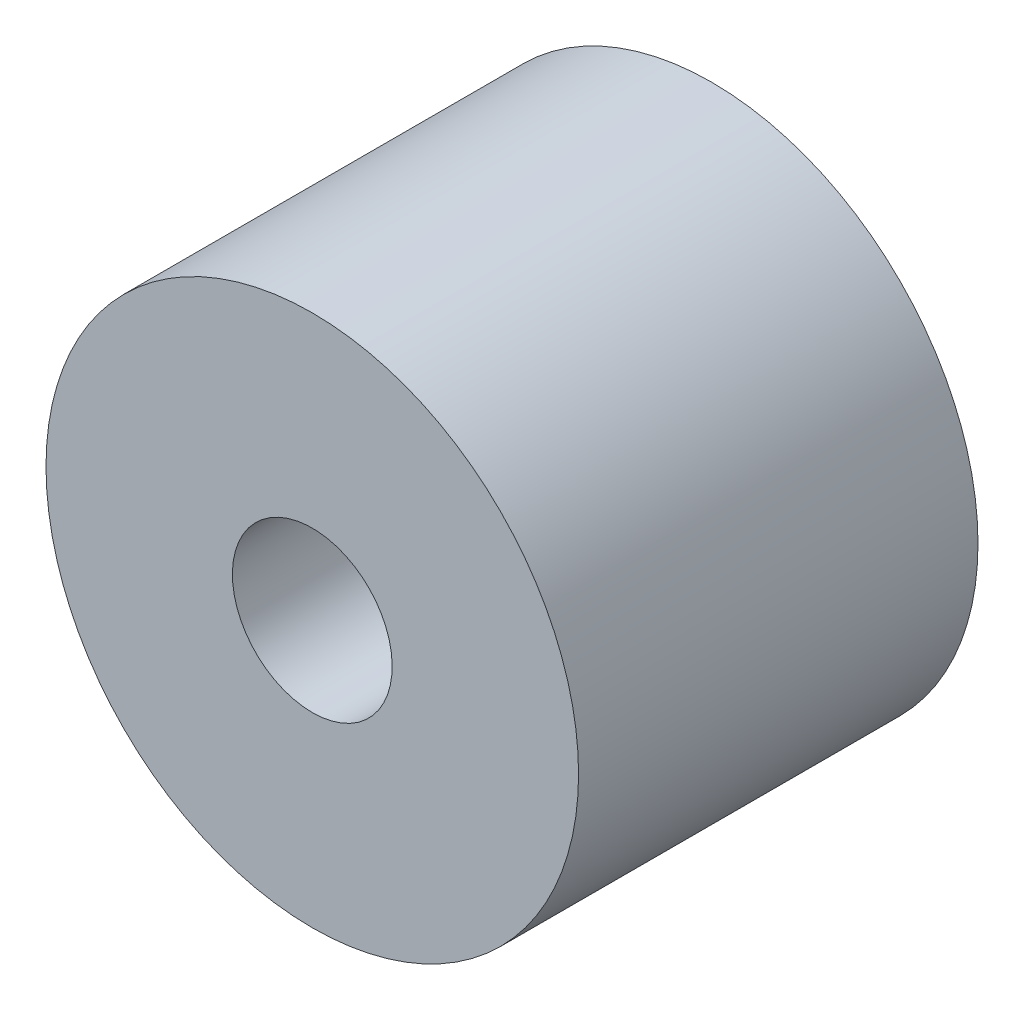
ISO-10303-21;
HEADER;
FILE_DESCRIPTION(('STEP AP214'),'2;1');
FILE_NAME('part.step','',(''),(''),'','','');
FILE_SCHEMA(('AUTOMOTIVE_DESIGN { 1 0 10303 214 1 1 1 1 }'));
ENDSEC;
DATA;
#1=APPLICATION_CONTEXT('core data for automotive mechanical design processes');
#2=APPLICATION_PROTOCOL_DEFINITION('international standard','automotive_design',2000,#1);
#3=PRODUCT_CONTEXT('',#1,'mechanical');
#4=PRODUCT('Part','Part','',(#3));
#5=PRODUCT_RELATED_PRODUCT_CATEGORY('part','',(#4));
#6=PRODUCT_DEFINITION_FORMATION('','',#4);
#7=PRODUCT_DEFINITION_CONTEXT('part definition',#1,'design');
#8=PRODUCT_DEFINITION('design','',#6,#7);
#9=PRODUCT_DEFINITION_SHAPE('','',#8);
#10=(LENGTH_UNIT() NAMED_UNIT(*) SI_UNIT(.MILLI.,.METRE.));
#11=(NAMED_UNIT(*) PLANE_ANGLE_UNIT() SI_UNIT($,.RADIAN.));
#12=(NAMED_UNIT(*) SI_UNIT($,.STERADIAN.) SOLID_ANGLE_UNIT());
#13=UNCERTAINTY_MEASURE_WITH_UNIT(LENGTH_MEASURE(1.E-05),#10,'distance_accuracy_value','');
#14=(GEOMETRIC_REPRESENTATION_CONTEXT(3) GLOBAL_UNCERTAINTY_ASSIGNED_CONTEXT((#13)) GLOBAL_UNIT_ASSIGNED_CONTEXT((#10,
#11,#12)) REPRESENTATION_CONTEXT('',''));
#15=CARTESIAN_POINT('',(0.,0.,0.));
#16=DIRECTION('',(0.,0.,1.));
#17=DIRECTION('',(1.,0.,0.));
#18=AXIS2_PLACEMENT_3D('',#15,#16,#17);
#19=CARTESIAN_POINT('',(0.,0.,9.99999999999999));
#20=DIRECTION('',(0.,0.,-1.));
#21=DIRECTION('',(0.,1.,0.));
#22=AXIS2_PLACEMENT_3D('',#19,#20,#21);
#23=PLANE('',#22);
#24=CARTESIAN_POINT('',(0.,0.,9.99999999999999));
#25=DIRECTION('',(0.,0.,1.));
#26=DIRECTION('',(0.,-1.,0.));
#27=AXIS2_PLACEMENT_3D('',#24,#25,#26);
#28=CIRCLE('',#27,6.);
#29=CARTESIAN_POINT('',(0.,-6.,9.99999999999999));
#30=VERTEX_POINT('',#29);
#31=EDGE_CURVE('E10',#30,#30,#28,.T.);
#32=ORIENTED_EDGE('',*,*,#31,.T.);
#33=EDGE_LOOP('',(#32));
#34=FACE_BOUND('',#33,.T.);
#35=ADVANCED_FACE('F38',(#34),#23,.F.);
#36=CARTESIAN_POINT('',(0.,0.,30.));
#37=DIRECTION('',(0.,0.,1.));
#38=DIRECTION('',(0.,-1.,0.));
#39=AXIS2_PLACEMENT_3D('',#36,#37,#38);
#40=CYLINDRICAL_SURFACE('',#39,6.);
#41=ORIENTED_EDGE('',*,*,#31,.F.);
#42=EDGE_LOOP('',(#41));
#43=FACE_BOUND('',#42,.T.);
#44=CARTESIAN_POINT('',(0.,0.,30.));
#45=DIRECTION('',(0.,0.,1.));
#46=DIRECTION('',(0.,-1.,0.));
#47=AXIS2_PLACEMENT_3D('',#44,#45,#46);
#48=CIRCLE('',#47,6.00000000000001);
#49=CARTESIAN_POINT('',(0.,-6.00000000000001,30.));
#50=VERTEX_POINT('',#49);
#51=EDGE_CURVE('E44',#50,#50,#48,.T.);
#52=ORIENTED_EDGE('',*,*,#51,.T.);
#53=EDGE_LOOP('',(#52));
#54=FACE_BOUND('',#53,.T.);
#55=ADVANCED_FACE('F70',(#43,#54),#40,.F.);
#56=CARTESIAN_POINT('',(0.,0.,30.));
#57=DIRECTION('',(0.,0.,-1.));
#58=DIRECTION('',(0.,1.,0.));
#59=AXIS2_PLACEMENT_3D('',#56,#57,#58);
#60=PLANE('',#59);
#61=ORIENTED_EDGE('',*,*,#51,.F.);
#62=EDGE_LOOP('',(#61));
#63=FACE_BOUND('',#62,.T.);
#64=CARTESIAN_POINT('',(0.,0.,30.));
#65=DIRECTION('',(0.,0.,1.));
#66=DIRECTION('',(0.,-1.,0.));
#67=AXIS2_PLACEMENT_3D('',#64,#65,#66);
#68=CIRCLE('',#67,20.);
#69=CARTESIAN_POINT('',(0.,-20.,30.));
#70=VERTEX_POINT('',#69);
#71=EDGE_CURVE('E48',#70,#70,#68,.T.);
#72=ORIENTED_EDGE('',*,*,#71,.T.);
#73=EDGE_LOOP('',(#72));
#74=FACE_BOUND('',#73,.T.);
#75=ADVANCED_FACE('F66',(#63,#74),#60,.F.);
#76=CARTESIAN_POINT('',(0.,0.,30.));
#77=DIRECTION('',(0.,0.,1.));
#78=DIRECTION('',(0.,-1.,0.));
#79=AXIS2_PLACEMENT_3D('',#76,#77,#78);
#80=CYLINDRICAL_SURFACE('',#79,20.);
#81=ORIENTED_EDGE('',*,*,#71,.F.);
#82=EDGE_LOOP('',(#81));
#83=FACE_BOUND('',#82,.T.);
#84=CARTESIAN_POINT('',(0.,0.,0.));
#85=DIRECTION('',(0.,0.,1.));
#86=DIRECTION('',(0.,-1.,0.));
#87=AXIS2_PLACEMENT_3D('',#84,#85,#86);
#88=CIRCLE('',#87,20.);
#89=CARTESIAN_POINT('',(0.,-20.,0.));
#90=VERTEX_POINT('',#89);
#91=EDGE_CURVE('E52',#90,#90,#88,.T.);
#92=ORIENTED_EDGE('',*,*,#91,.T.);
#93=EDGE_LOOP('',(#92));
#94=FACE_BOUND('',#93,.T.);
#95=ADVANCED_FACE('F58',(#83,#94),#80,.T.);
#96=CARTESIAN_POINT('',(0.,0.,0.));
#97=DIRECTION('',(0.,0.,1.));
#98=DIRECTION('',(0.,-1.,0.));
#99=AXIS2_PLACEMENT_3D('',#96,#97,#98);
#100=PLANE('',#99);
#101=ORIENTED_EDGE('',*,*,#91,.F.);
#102=EDGE_LOOP('',(#101));
#103=FACE_BOUND('',#102,.T.);
#104=ADVANCED_FACE('F60',(#103),#100,.F.);
#105=CLOSED_SHELL('',(#35,#55,#75,#95,#104));
#106=MANIFOLD_SOLID_BREP('B2',#105);
#107=ADVANCED_BREP_SHAPE_REPRESENTATION('',(#18,#106),#14);
#108=SHAPE_DEFINITION_REPRESENTATION(#9,#107);
ENDSEC;
END-ISO-10303-21;
